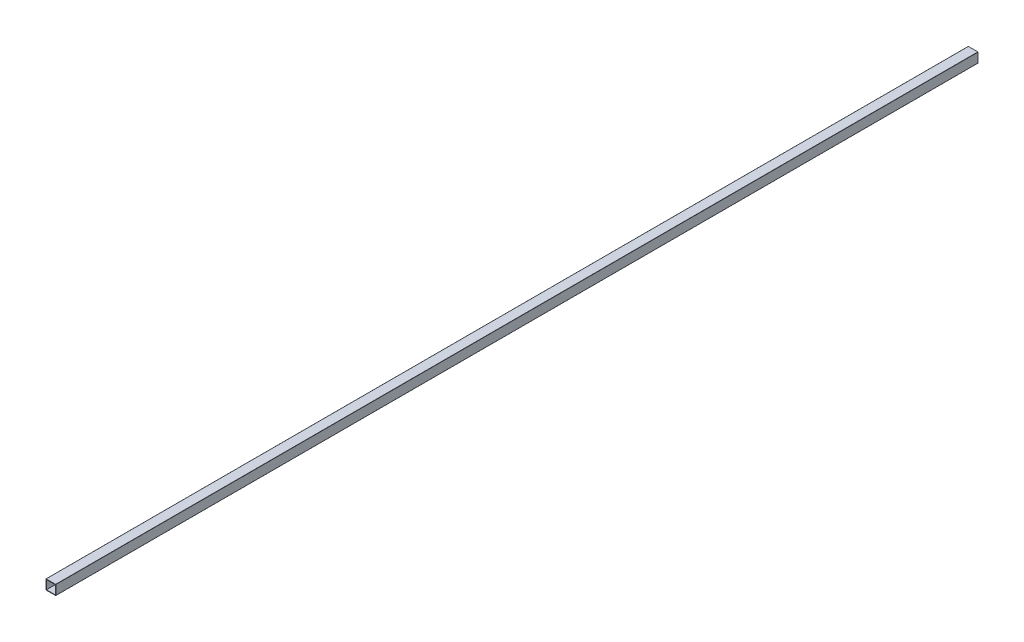
ISO-10303-21;
HEADER;
FILE_DESCRIPTION(('STEP AP214'),'2;1');
FILE_NAME('part.step','',(''),(''),'','','');
FILE_SCHEMA(('AUTOMOTIVE_DESIGN { 1 0 10303 214 1 1 1 1 }'));
ENDSEC;
DATA;
#1=APPLICATION_CONTEXT('core data for automotive mechanical design processes');
#2=APPLICATION_PROTOCOL_DEFINITION('international standard','automotive_design',2000,#1);
#3=PRODUCT_CONTEXT('',#1,'mechanical');
#4=PRODUCT('Part','Part','',(#3));
#5=PRODUCT_RELATED_PRODUCT_CATEGORY('part','',(#4));
#6=PRODUCT_DEFINITION_FORMATION('','',#4);
#7=PRODUCT_DEFINITION_CONTEXT('part definition',#1,'design');
#8=PRODUCT_DEFINITION('design','',#6,#7);
#9=PRODUCT_DEFINITION_SHAPE('','',#8);
#10=(LENGTH_UNIT() NAMED_UNIT(*) SI_UNIT(.MILLI.,.METRE.));
#11=(NAMED_UNIT(*) PLANE_ANGLE_UNIT() SI_UNIT($,.RADIAN.));
#12=(NAMED_UNIT(*) SI_UNIT($,.STERADIAN.) SOLID_ANGLE_UNIT());
#13=UNCERTAINTY_MEASURE_WITH_UNIT(LENGTH_MEASURE(1.E-05),#10,'distance_accuracy_value','');
#14=(GEOMETRIC_REPRESENTATION_CONTEXT(3) GLOBAL_UNCERTAINTY_ASSIGNED_CONTEXT((#13)) GLOBAL_UNIT_ASSIGNED_CONTEXT((#10,
#11,#12)) REPRESENTATION_CONTEXT('',''));
#15=CARTESIAN_POINT('',(0.,0.,0.));
#16=DIRECTION('',(0.,0.,1.));
#17=DIRECTION('',(1.,0.,0.));
#18=AXIS2_PLACEMENT_3D('',#15,#16,#17);
#19=CARTESIAN_POINT('',(30.75,30.75,6000.));
#20=DIRECTION('',(0.,0.,-1.));
#21=DIRECTION('',(-1.,0.,0.));
#22=AXIS2_PLACEMENT_3D('',#19,#20,#21);
#23=PLANE('',#22);
#24=CARTESIAN_POINT('',(30.75,30.75,6000.));
#25=DIRECTION('',(0.,0.,1.));
#26=DIRECTION('',(-1.,0.,0.));
#27=AXIS2_PLACEMENT_3D('',#24,#25,#26);
#28=CIRCLE('',#27,1.);
#29=CARTESIAN_POINT('',(31.75,30.75,6000.));
#30=VERTEX_POINT('',#29);
#31=CARTESIAN_POINT('',(30.75,31.75,6000.));
#32=VERTEX_POINT('',#31);
#33=EDGE_CURVE('E158',#30,#32,#28,.T.);
#34=ORIENTED_EDGE('',*,*,#33,.T.);
#35=DIRECTION('',(-1.,0.,0.));
#36=VECTOR('',#35,1.);
#37=CARTESIAN_POINT('',(-30.75,31.75,6000.));
#38=LINE('',#37,#36);
#39=CARTESIAN_POINT('',(-30.75,31.75,6000.));
#40=VERTEX_POINT('',#39);
#41=EDGE_CURVE('E161',#32,#40,#38,.T.);
#42=ORIENTED_EDGE('',*,*,#41,.T.);
#43=CARTESIAN_POINT('',(-30.75,30.75,6000.));
#44=DIRECTION('',(0.,0.,1.));
#45=DIRECTION('',(-1.,0.,0.));
#46=AXIS2_PLACEMENT_3D('',#43,#44,#45);
#47=CIRCLE('',#46,1.);
#48=CARTESIAN_POINT('',(-31.75,30.75,6000.));
#49=VERTEX_POINT('',#48);
#50=EDGE_CURVE('E164',#40,#49,#47,.T.);
#51=ORIENTED_EDGE('',*,*,#50,.T.);
#52=DIRECTION('',(0.,-1.,0.));
#53=VECTOR('',#52,1.);
#54=CARTESIAN_POINT('',(-31.75,-30.75,6000.));
#55=LINE('',#54,#53);
#56=CARTESIAN_POINT('',(-31.75,-30.75,6000.));
#57=VERTEX_POINT('',#56);
#58=EDGE_CURVE('E166',#49,#57,#55,.T.);
#59=ORIENTED_EDGE('',*,*,#58,.T.);
#60=CARTESIAN_POINT('',(-30.75,-30.75,6000.));
#61=DIRECTION('',(0.,0.,1.));
#62=DIRECTION('',(-1.,0.,0.));
#63=AXIS2_PLACEMENT_3D('',#60,#61,#62);
#64=CIRCLE('',#63,1.);
#65=CARTESIAN_POINT('',(-30.75,-31.75,6000.));
#66=VERTEX_POINT('',#65);
#67=EDGE_CURVE('E168',#57,#66,#64,.T.);
#68=ORIENTED_EDGE('',*,*,#67,.T.);
#69=DIRECTION('',(1.,0.,0.));
#70=VECTOR('',#69,1.);
#71=CARTESIAN_POINT('',(-30.75,-31.75,6000.));
#72=LINE('',#71,#70);
#73=CARTESIAN_POINT('',(30.75,-31.75,6000.));
#74=VERTEX_POINT('',#73);
#75=EDGE_CURVE('E170',#66,#74,#72,.T.);
#76=ORIENTED_EDGE('',*,*,#75,.T.);
#77=CARTESIAN_POINT('',(30.75,-30.75,6000.));
#78=DIRECTION('',(0.,0.,1.));
#79=DIRECTION('',(1.,0.,0.));
#80=AXIS2_PLACEMENT_3D('',#77,#78,#79);
#81=CIRCLE('',#80,1.);
#82=CARTESIAN_POINT('',(31.75,-30.75,6000.));
#83=VERTEX_POINT('',#82);
#84=EDGE_CURVE('E172',#74,#83,#81,.T.);
#85=ORIENTED_EDGE('',*,*,#84,.T.);
#86=DIRECTION('',(0.,1.,0.));
#87=VECTOR('',#86,1.);
#88=CARTESIAN_POINT('',(31.75,-30.75,6000.));
#89=LINE('',#88,#87);
#90=EDGE_CURVE('E174',#83,#30,#89,.T.);
#91=ORIENTED_EDGE('',*,*,#90,.T.);
#92=EDGE_LOOP('',(#34,#42,#51,#59,#68,#76,#85,#91));
#93=FACE_BOUND('',#92,.T.);
#94=DIRECTION('',(1.,0.,0.));
#95=VECTOR('',#94,1.);
#96=CARTESIAN_POINT('',(-28.71,-28.71,6000.));
#97=LINE('',#96,#95);
#98=CARTESIAN_POINT('',(-28.71,-28.71,6000.));
#99=VERTEX_POINT('',#98);
#100=CARTESIAN_POINT('',(28.71,-28.71,6000.));
#101=VERTEX_POINT('',#100);
#102=EDGE_CURVE('E122',#99,#101,#97,.T.);
#103=ORIENTED_EDGE('',*,*,#102,.F.);
#104=DIRECTION('',(0.,-1.,0.));
#105=VECTOR('',#104,1.);
#106=CARTESIAN_POINT('',(-28.71,-28.71,6000.));
#107=LINE('',#106,#105);
#108=CARTESIAN_POINT('',(-28.71,28.71,6000.));
#109=VERTEX_POINT('',#108);
#110=EDGE_CURVE('E144',#109,#99,#107,.T.);
#111=ORIENTED_EDGE('',*,*,#110,.F.);
#112=DIRECTION('',(-1.,0.,0.));
#113=VECTOR('',#112,1.);
#114=CARTESIAN_POINT('',(-28.71,28.71,6000.));
#115=LINE('',#114,#113);
#116=CARTESIAN_POINT('',(28.71,28.71,6000.));
#117=VERTEX_POINT('',#116);
#118=EDGE_CURVE('E142',#117,#109,#115,.T.);
#119=ORIENTED_EDGE('',*,*,#118,.F.);
#120=DIRECTION('',(0.,1.,0.));
#121=VECTOR('',#120,1.);
#122=CARTESIAN_POINT('',(28.71,-28.71,6000.));
#123=LINE('',#122,#121);
#124=EDGE_CURVE('E130',#101,#117,#123,.T.);
#125=ORIENTED_EDGE('',*,*,#124,.F.);
#126=EDGE_LOOP('',(#103,#111,#119,#125));
#127=FACE_BOUND('',#126,.T.);
#128=ADVANCED_FACE('F33',(#93,#127),#23,.F.);
#129=CARTESIAN_POINT('',(30.75,30.75,0.));
#130=DIRECTION('',(0.,0.,-1.));
#131=DIRECTION('',(-1.,0.,0.));
#132=AXIS2_PLACEMENT_3D('',#129,#130,#131);
#133=PLANE('',#132);
#134=CARTESIAN_POINT('',(30.75,30.75,0.));
#135=DIRECTION('',(0.,0.,1.));
#136=DIRECTION('',(-1.,0.,0.));
#137=AXIS2_PLACEMENT_3D('',#134,#135,#136);
#138=CIRCLE('',#137,1.);
#139=CARTESIAN_POINT('',(31.75,30.75,0.));
#140=VERTEX_POINT('',#139);
#141=CARTESIAN_POINT('',(30.75,31.75,0.));
#142=VERTEX_POINT('',#141);
#143=EDGE_CURVE('E138',#140,#142,#138,.T.);
#144=ORIENTED_EDGE('',*,*,#143,.F.);
#145=DIRECTION('',(0.,1.,0.));
#146=VECTOR('',#145,1.);
#147=CARTESIAN_POINT('',(31.75,-30.75,0.));
#148=LINE('',#147,#146);
#149=CARTESIAN_POINT('',(31.75,-30.75,0.));
#150=VERTEX_POINT('',#149);
#151=EDGE_CURVE('E162',#150,#140,#148,.T.);
#152=ORIENTED_EDGE('',*,*,#151,.F.);
#153=CARTESIAN_POINT('',(30.75,-30.75,0.));
#154=DIRECTION('',(0.,0.,1.));
#155=DIRECTION('',(1.,0.,0.));
#156=AXIS2_PLACEMENT_3D('',#153,#154,#155);
#157=CIRCLE('',#156,1.);
#158=CARTESIAN_POINT('',(30.75,-31.75,0.));
#159=VERTEX_POINT('',#158);
#160=EDGE_CURVE('E189',#159,#150,#157,.T.);
#161=ORIENTED_EDGE('',*,*,#160,.F.);
#162=DIRECTION('',(1.,0.,0.));
#163=VECTOR('',#162,1.);
#164=CARTESIAN_POINT('',(-30.75,-31.75,0.));
#165=LINE('',#164,#163);
#166=CARTESIAN_POINT('',(-30.75,-31.75,0.));
#167=VERTEX_POINT('',#166);
#168=EDGE_CURVE('E187',#167,#159,#165,.T.);
#169=ORIENTED_EDGE('',*,*,#168,.F.);
#170=CARTESIAN_POINT('',(-30.75,-30.75,0.));
#171=DIRECTION('',(0.,0.,1.));
#172=DIRECTION('',(-1.,0.,0.));
#173=AXIS2_PLACEMENT_3D('',#170,#171,#172);
#174=CIRCLE('',#173,1.);
#175=CARTESIAN_POINT('',(-31.75,-30.75,0.));
#176=VERTEX_POINT('',#175);
#177=EDGE_CURVE('E185',#176,#167,#174,.T.);
#178=ORIENTED_EDGE('',*,*,#177,.F.);
#179=DIRECTION('',(0.,-1.,0.));
#180=VECTOR('',#179,1.);
#181=CARTESIAN_POINT('',(-31.75,-30.75,0.));
#182=LINE('',#181,#180);
#183=CARTESIAN_POINT('',(-31.75,30.75,0.));
#184=VERTEX_POINT('',#183);
#185=EDGE_CURVE('E183',#184,#176,#182,.T.);
#186=ORIENTED_EDGE('',*,*,#185,.F.);
#187=CARTESIAN_POINT('',(-30.75,30.75,0.));
#188=DIRECTION('',(0.,0.,1.));
#189=DIRECTION('',(-1.,0.,0.));
#190=AXIS2_PLACEMENT_3D('',#187,#188,#189);
#191=CIRCLE('',#190,1.);
#192=CARTESIAN_POINT('',(-30.75,31.75,0.));
#193=VERTEX_POINT('',#192);
#194=EDGE_CURVE('E181',#193,#184,#191,.T.);
#195=ORIENTED_EDGE('',*,*,#194,.F.);
#196=DIRECTION('',(-1.,0.,0.));
#197=VECTOR('',#196,1.);
#198=CARTESIAN_POINT('',(-30.75,31.75,0.));
#199=LINE('',#198,#197);
#200=EDGE_CURVE('E179',#142,#193,#199,.T.);
#201=ORIENTED_EDGE('',*,*,#200,.F.);
#202=EDGE_LOOP('',(#144,#152,#161,#169,#178,#186,#195,#201));
#203=FACE_BOUND('',#202,.T.);
#204=DIRECTION('',(0.,-1.,0.));
#205=VECTOR('',#204,1.);
#206=CARTESIAN_POINT('',(-28.71,-28.71,0.));
#207=LINE('',#206,#205);
#208=CARTESIAN_POINT('',(-28.71,28.71,0.));
#209=VERTEX_POINT('',#208);
#210=CARTESIAN_POINT('',(-28.71,-28.71,0.));
#211=VERTEX_POINT('',#210);
#212=EDGE_CURVE('E131',#209,#211,#207,.T.);
#213=ORIENTED_EDGE('',*,*,#212,.T.);
#214=DIRECTION('',(1.,0.,0.));
#215=VECTOR('',#214,1.);
#216=CARTESIAN_POINT('',(-28.71,-28.71,0.));
#217=LINE('',#216,#215);
#218=CARTESIAN_POINT('',(28.71,-28.71,0.));
#219=VERTEX_POINT('',#218);
#220=EDGE_CURVE('E56',#211,#219,#217,.T.);
#221=ORIENTED_EDGE('',*,*,#220,.T.);
#222=DIRECTION('',(0.,1.,0.));
#223=VECTOR('',#222,1.);
#224=CARTESIAN_POINT('',(28.71,-28.71,0.));
#225=LINE('',#224,#223);
#226=CARTESIAN_POINT('',(28.71,28.71,0.));
#227=VERTEX_POINT('',#226);
#228=EDGE_CURVE('E137',#219,#227,#225,.T.);
#229=ORIENTED_EDGE('',*,*,#228,.T.);
#230=DIRECTION('',(-1.,0.,0.));
#231=VECTOR('',#230,1.);
#232=CARTESIAN_POINT('',(-28.71,28.71,0.));
#233=LINE('',#232,#231);
#234=EDGE_CURVE('E150',#227,#209,#233,.T.);
#235=ORIENTED_EDGE('',*,*,#234,.T.);
#236=EDGE_LOOP('',(#213,#221,#229,#235));
#237=FACE_BOUND('',#236,.T.);
#238=ADVANCED_FACE('F219',(#203,#237),#133,.T.);
#239=CARTESIAN_POINT('',(30.75,30.75,6000.));
#240=DIRECTION('',(0.,0.,-1.));
#241=DIRECTION('',(-1.,0.,0.));
#242=AXIS2_PLACEMENT_3D('',#239,#240,#241);
#243=CYLINDRICAL_SURFACE('',#242,1.);
#244=ORIENTED_EDGE('',*,*,#143,.T.);
#245=DIRECTION('',(0.,0.,-1.));
#246=VECTOR('',#245,1.);
#247=CARTESIAN_POINT('',(30.75,31.75,6000.));
#248=LINE('',#247,#246);
#249=EDGE_CURVE('E11',#32,#142,#248,.T.);
#250=ORIENTED_EDGE('',*,*,#249,.F.);
#251=ORIENTED_EDGE('',*,*,#33,.F.);
#252=DIRECTION('',(0.,0.,-1.));
#253=VECTOR('',#252,1.);
#254=CARTESIAN_POINT('',(31.75,30.75,6000.));
#255=LINE('',#254,#253);
#256=EDGE_CURVE('E176',#30,#140,#255,.T.);
#257=ORIENTED_EDGE('',*,*,#256,.T.);
#258=EDGE_LOOP('',(#244,#250,#251,#257));
#259=FACE_BOUND('',#258,.T.);
#260=ADVANCED_FACE('F35',(#259),#243,.T.);
#261=CARTESIAN_POINT('',(-30.75,31.75,6000.));
#262=DIRECTION('',(0.,-1.,0.));
#263=DIRECTION('',(0.,0.,-1.));
#264=AXIS2_PLACEMENT_3D('',#261,#262,#263);
#265=PLANE('',#264);
#266=ORIENTED_EDGE('',*,*,#200,.T.);
#267=DIRECTION('',(0.,0.,-1.));
#268=VECTOR('',#267,1.);
#269=CARTESIAN_POINT('',(-30.75,31.75,6000.));
#270=LINE('',#269,#268);
#271=EDGE_CURVE('E41',#40,#193,#270,.T.);
#272=ORIENTED_EDGE('',*,*,#271,.F.);
#273=ORIENTED_EDGE('',*,*,#41,.F.);
#274=ORIENTED_EDGE('',*,*,#249,.T.);
#275=EDGE_LOOP('',(#266,#272,#273,#274));
#276=FACE_BOUND('',#275,.T.);
#277=ADVANCED_FACE('F236',(#276),#265,.F.);
#278=CARTESIAN_POINT('',(-30.75,30.75,6000.));
#279=DIRECTION('',(0.,0.,-1.));
#280=DIRECTION('',(-1.,0.,0.));
#281=AXIS2_PLACEMENT_3D('',#278,#279,#280);
#282=CYLINDRICAL_SURFACE('',#281,1.);
#283=ORIENTED_EDGE('',*,*,#194,.T.);
#284=DIRECTION('',(0.,0.,-1.));
#285=VECTOR('',#284,1.);
#286=CARTESIAN_POINT('',(-31.75,30.75,6000.));
#287=LINE('',#286,#285);
#288=EDGE_CURVE('E206',#49,#184,#287,.T.);
#289=ORIENTED_EDGE('',*,*,#288,.F.);
#290=ORIENTED_EDGE('',*,*,#50,.F.);
#291=ORIENTED_EDGE('',*,*,#271,.T.);
#292=EDGE_LOOP('',(#283,#289,#290,#291));
#293=FACE_BOUND('',#292,.T.);
#294=ADVANCED_FACE('F213',(#293),#282,.T.);
#295=CARTESIAN_POINT('',(-31.75,-30.75,6000.));
#296=DIRECTION('',(1.,0.,0.));
#297=DIRECTION('',(0.,0.,-1.));
#298=AXIS2_PLACEMENT_3D('',#295,#296,#297);
#299=PLANE('',#298);
#300=ORIENTED_EDGE('',*,*,#185,.T.);
#301=DIRECTION('',(0.,0.,-1.));
#302=VECTOR('',#301,1.);
#303=CARTESIAN_POINT('',(-31.75,-30.75,6000.));
#304=LINE('',#303,#302);
#305=EDGE_CURVE('E203',#57,#176,#304,.T.);
#306=ORIENTED_EDGE('',*,*,#305,.F.);
#307=ORIENTED_EDGE('',*,*,#58,.F.);
#308=ORIENTED_EDGE('',*,*,#288,.T.);
#309=EDGE_LOOP('',(#300,#306,#307,#308));
#310=FACE_BOUND('',#309,.T.);
#311=ADVANCED_FACE('F225',(#310),#299,.F.);
#312=CARTESIAN_POINT('',(-30.75,-30.75,6000.));
#313=DIRECTION('',(0.,0.,-1.));
#314=DIRECTION('',(-1.,0.,0.));
#315=AXIS2_PLACEMENT_3D('',#312,#313,#314);
#316=CYLINDRICAL_SURFACE('',#315,1.);
#317=ORIENTED_EDGE('',*,*,#177,.T.);
#318=DIRECTION('',(0.,0.,-1.));
#319=VECTOR('',#318,1.);
#320=CARTESIAN_POINT('',(-30.75,-31.75,6000.));
#321=LINE('',#320,#319);
#322=EDGE_CURVE('E200',#66,#167,#321,.T.);
#323=ORIENTED_EDGE('',*,*,#322,.F.);
#324=ORIENTED_EDGE('',*,*,#67,.F.);
#325=ORIENTED_EDGE('',*,*,#305,.T.);
#326=EDGE_LOOP('',(#317,#323,#324,#325));
#327=FACE_BOUND('',#326,.T.);
#328=ADVANCED_FACE('F229',(#327),#316,.T.);
#329=CARTESIAN_POINT('',(-30.75,-31.75,6000.));
#330=DIRECTION('',(0.,1.,0.));
#331=DIRECTION('',(0.,0.,1.));
#332=AXIS2_PLACEMENT_3D('',#329,#330,#331);
#333=PLANE('',#332);
#334=ORIENTED_EDGE('',*,*,#168,.T.);
#335=DIRECTION('',(0.,0.,-1.));
#336=VECTOR('',#335,1.);
#337=CARTESIAN_POINT('',(30.75,-31.75,6000.));
#338=LINE('',#337,#336);
#339=EDGE_CURVE('E197',#74,#159,#338,.T.);
#340=ORIENTED_EDGE('',*,*,#339,.F.);
#341=ORIENTED_EDGE('',*,*,#75,.F.);
#342=ORIENTED_EDGE('',*,*,#322,.T.);
#343=EDGE_LOOP('',(#334,#340,#341,#342));
#344=FACE_BOUND('',#343,.T.);
#345=ADVANCED_FACE('F249',(#344),#333,.F.);
#346=CARTESIAN_POINT('',(30.75,-30.75,6000.));
#347=DIRECTION('',(0.,0.,-1.));
#348=DIRECTION('',(-1.,0.,0.));
#349=AXIS2_PLACEMENT_3D('',#346,#347,#348);
#350=CYLINDRICAL_SURFACE('',#349,1.);
#351=ORIENTED_EDGE('',*,*,#160,.T.);
#352=DIRECTION('',(0.,0.,-1.));
#353=VECTOR('',#352,1.);
#354=CARTESIAN_POINT('',(31.75,-30.75,6000.));
#355=LINE('',#354,#353);
#356=EDGE_CURVE('E194',#83,#150,#355,.T.);
#357=ORIENTED_EDGE('',*,*,#356,.F.);
#358=ORIENTED_EDGE('',*,*,#84,.F.);
#359=ORIENTED_EDGE('',*,*,#339,.T.);
#360=EDGE_LOOP('',(#351,#357,#358,#359));
#361=FACE_BOUND('',#360,.T.);
#362=ADVANCED_FACE('F247',(#361),#350,.T.);
#363=CARTESIAN_POINT('',(31.75,-30.75,6000.));
#364=DIRECTION('',(-1.,0.,0.));
#365=DIRECTION('',(0.,0.,1.));
#366=AXIS2_PLACEMENT_3D('',#363,#364,#365);
#367=PLANE('',#366);
#368=ORIENTED_EDGE('',*,*,#151,.T.);
#369=ORIENTED_EDGE('',*,*,#256,.F.);
#370=ORIENTED_EDGE('',*,*,#90,.F.);
#371=ORIENTED_EDGE('',*,*,#356,.T.);
#372=EDGE_LOOP('',(#368,#369,#370,#371));
#373=FACE_BOUND('',#372,.T.);
#374=ADVANCED_FACE('F242',(#373),#367,.F.);
#375=CARTESIAN_POINT('',(-28.71,-28.71,6000.));
#376=DIRECTION('',(0.,1.,0.));
#377=DIRECTION('',(0.,0.,1.));
#378=AXIS2_PLACEMENT_3D('',#375,#376,#377);
#379=PLANE('',#378);
#380=ORIENTED_EDGE('',*,*,#220,.F.);
#381=DIRECTION('',(0.,0.,-1.));
#382=VECTOR('',#381,1.);
#383=CARTESIAN_POINT('',(-28.71,-28.71,6000.));
#384=LINE('',#383,#382);
#385=EDGE_CURVE('E126',#99,#211,#384,.T.);
#386=ORIENTED_EDGE('',*,*,#385,.F.);
#387=ORIENTED_EDGE('',*,*,#102,.T.);
#388=DIRECTION('',(0.,0.,-1.));
#389=VECTOR('',#388,1.);
#390=CARTESIAN_POINT('',(28.71,-28.71,6000.));
#391=LINE('',#390,#389);
#392=EDGE_CURVE('E125',#101,#219,#391,.T.);
#393=ORIENTED_EDGE('',*,*,#392,.T.);
#394=EDGE_LOOP('',(#380,#386,#387,#393));
#395=FACE_BOUND('',#394,.T.);
#396=ADVANCED_FACE('F124',(#395),#379,.T.);
#397=CARTESIAN_POINT('',(28.71,-28.71,6000.));
#398=DIRECTION('',(-1.,0.,0.));
#399=DIRECTION('',(0.,-1.,0.));
#400=AXIS2_PLACEMENT_3D('',#397,#398,#399);
#401=PLANE('',#400);
#402=ORIENTED_EDGE('',*,*,#228,.F.);
#403=ORIENTED_EDGE('',*,*,#392,.F.);
#404=ORIENTED_EDGE('',*,*,#124,.T.);
#405=DIRECTION('',(0.,0.,-1.));
#406=VECTOR('',#405,1.);
#407=CARTESIAN_POINT('',(28.71,28.71,6000.));
#408=LINE('',#407,#406);
#409=EDGE_CURVE('E139',#117,#227,#408,.T.);
#410=ORIENTED_EDGE('',*,*,#409,.T.);
#411=EDGE_LOOP('',(#402,#403,#404,#410));
#412=FACE_BOUND('',#411,.T.);
#413=ADVANCED_FACE('F134',(#412),#401,.T.);
#414=CARTESIAN_POINT('',(-28.71,28.71,6000.));
#415=DIRECTION('',(0.,-1.,0.));
#416=DIRECTION('',(1.,0.,0.));
#417=AXIS2_PLACEMENT_3D('',#414,#415,#416);
#418=PLANE('',#417);
#419=ORIENTED_EDGE('',*,*,#234,.F.);
#420=ORIENTED_EDGE('',*,*,#409,.F.);
#421=ORIENTED_EDGE('',*,*,#118,.T.);
#422=DIRECTION('',(0.,0.,-1.));
#423=VECTOR('',#422,1.);
#424=CARTESIAN_POINT('',(-28.71,28.71,6000.));
#425=LINE('',#424,#423);
#426=EDGE_CURVE('E48',#109,#209,#425,.T.);
#427=ORIENTED_EDGE('',*,*,#426,.T.);
#428=EDGE_LOOP('',(#419,#420,#421,#427));
#429=FACE_BOUND('',#428,.T.);
#430=ADVANCED_FACE('F274',(#429),#418,.T.);
#431=CARTESIAN_POINT('',(-28.71,-28.71,6000.));
#432=DIRECTION('',(1.,0.,0.));
#433=DIRECTION('',(0.,0.,-1.));
#434=AXIS2_PLACEMENT_3D('',#431,#432,#433);
#435=PLANE('',#434);
#436=ORIENTED_EDGE('',*,*,#212,.F.);
#437=ORIENTED_EDGE('',*,*,#426,.F.);
#438=ORIENTED_EDGE('',*,*,#110,.T.);
#439=ORIENTED_EDGE('',*,*,#385,.T.);
#440=EDGE_LOOP('',(#436,#437,#438,#439));
#441=FACE_BOUND('',#440,.T.);
#442=ADVANCED_FACE('F278',(#441),#435,.T.);
#443=CLOSED_SHELL('',(#128,#238,#260,#277,#294,#311,#328,#345,#362,#374,#396,#413,#430,#442));
#444=MANIFOLD_SOLID_BREP('B2',#443);
#445=ADVANCED_BREP_SHAPE_REPRESENTATION('',(#18,#444),#14);
#446=SHAPE_DEFINITION_REPRESENTATION(#9,#445);
ENDSEC;
END-ISO-10303-21;
